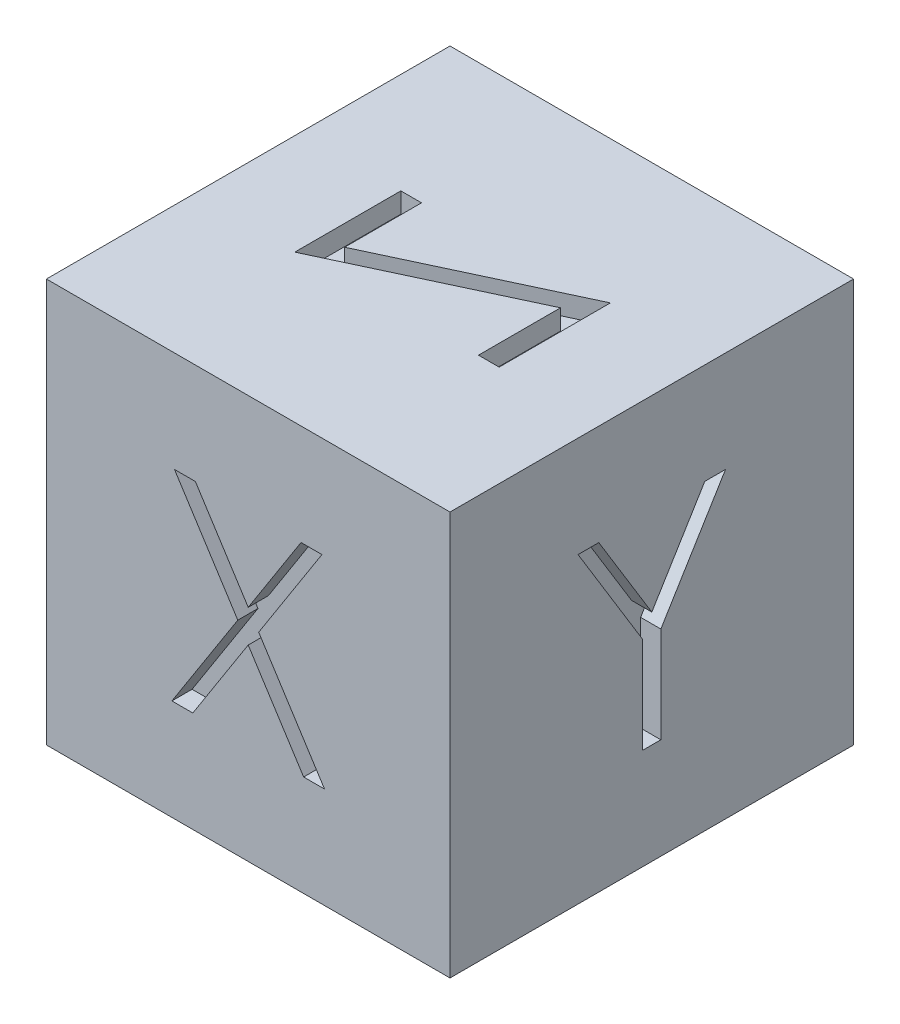
ISO-10303-21;
HEADER;
FILE_DESCRIPTION(('STEP AP214'),'2;1');
FILE_NAME('part.step','',(''),(''),'','','');
FILE_SCHEMA(('AUTOMOTIVE_DESIGN { 1 0 10303 214 1 1 1 1 }'));
ENDSEC;
DATA;
#1=APPLICATION_CONTEXT('core data for automotive mechanical design processes');
#2=APPLICATION_PROTOCOL_DEFINITION('international standard','automotive_design',2000,#1);
#3=PRODUCT_CONTEXT('',#1,'mechanical');
#4=PRODUCT('Part','Part','',(#3));
#5=PRODUCT_RELATED_PRODUCT_CATEGORY('part','',(#4));
#6=PRODUCT_DEFINITION_FORMATION('','',#4);
#7=PRODUCT_DEFINITION_CONTEXT('part definition',#1,'design');
#8=PRODUCT_DEFINITION('design','',#6,#7);
#9=PRODUCT_DEFINITION_SHAPE('','',#8);
#10=(LENGTH_UNIT() NAMED_UNIT(*) SI_UNIT(.MILLI.,.METRE.));
#11=(NAMED_UNIT(*) PLANE_ANGLE_UNIT() SI_UNIT($,.RADIAN.));
#12=(NAMED_UNIT(*) SI_UNIT($,.STERADIAN.) SOLID_ANGLE_UNIT());
#13=UNCERTAINTY_MEASURE_WITH_UNIT(LENGTH_MEASURE(1.E-05),#10,'distance_accuracy_value','');
#14=(GEOMETRIC_REPRESENTATION_CONTEXT(3) GLOBAL_UNCERTAINTY_ASSIGNED_CONTEXT((#13)) GLOBAL_UNIT_ASSIGNED_CONTEXT((#10,
#11,#12)) REPRESENTATION_CONTEXT('',''));
#15=CARTESIAN_POINT('',(0.,0.,0.));
#16=DIRECTION('',(0.,0.,1.));
#17=DIRECTION('',(1.,0.,0.));
#18=AXIS2_PLACEMENT_3D('',#15,#16,#17);
#19=CARTESIAN_POINT('',(10.,-10.,20.));
#20=DIRECTION('',(-1.,0.,0.));
#21=DIRECTION('',(0.,0.,1.));
#22=AXIS2_PLACEMENT_3D('',#19,#20,#21);
#23=PLANE('',#22);
#24=DIRECTION('',(0.,1.,0.));
#25=VECTOR('',#24,1.);
#26=CARTESIAN_POINT('',(10.,-10.,0.));
#27=LINE('',#26,#25);
#28=CARTESIAN_POINT('',(10.,-10.,0.));
#29=VERTEX_POINT('',#28);
#30=CARTESIAN_POINT('',(10.,10.,0.));
#31=VERTEX_POINT('',#30);
#32=EDGE_CURVE('E473',#29,#31,#27,.T.);
#33=ORIENTED_EDGE('',*,*,#32,.T.);
#34=DIRECTION('',(0.,0.,-1.));
#35=VECTOR('',#34,1.);
#36=CARTESIAN_POINT('',(10.,10.,20.));
#37=LINE('',#36,#35);
#38=CARTESIAN_POINT('',(10.,10.,20.));
#39=VERTEX_POINT('',#38);
#40=EDGE_CURVE('E11',#39,#31,#37,.T.);
#41=ORIENTED_EDGE('',*,*,#40,.F.);
#42=DIRECTION('',(0.,1.,0.));
#43=VECTOR('',#42,1.);
#44=CARTESIAN_POINT('',(10.,-10.,20.));
#45=LINE('',#44,#43);
#46=CARTESIAN_POINT('',(10.,-10.,20.));
#47=VERTEX_POINT('',#46);
#48=EDGE_CURVE('E474',#47,#39,#45,.T.);
#49=ORIENTED_EDGE('',*,*,#48,.F.);
#50=DIRECTION('',(0.,0.,-1.));
#51=VECTOR('',#50,1.);
#52=CARTESIAN_POINT('',(10.,-10.,20.));
#53=LINE('',#52,#51);
#54=EDGE_CURVE('E484',#47,#29,#53,.T.);
#55=ORIENTED_EDGE('',*,*,#54,.T.);
#56=EDGE_LOOP('',(#33,#41,#49,#55));
#57=FACE_BOUND('',#56,.T.);
#58=DIRECTION('',(0.,0.853354313900651,0.521331386880887));
#59=VECTOR('',#58,1.);
#60=CARTESIAN_POINT('',(10.,-0.246394230769231,10.448717948718));
#61=LINE('',#60,#59);
#62=CARTESIAN_POINT('',(10.,-0.246394230769231,10.448717948718));
#63=VERTEX_POINT('',#62);
#64=CARTESIAN_POINT('',(10.,5.,13.6538461538462));
#65=VERTEX_POINT('',#64);
#66=EDGE_CURVE('E60',#63,#65,#61,.T.);
#67=ORIENTED_EDGE('',*,*,#66,.T.);
#68=DIRECTION('',(0.,0.,-1.));
#69=VECTOR('',#68,1.);
#70=CARTESIAN_POINT('',(10.,5.,13.6538461538462));
#71=LINE('',#70,#69);
#72=CARTESIAN_POINT('',(10.,5.,12.6262019230769));
#73=VERTEX_POINT('',#72);
#74=EDGE_CURVE('E346',#65,#73,#71,.T.);
#75=ORIENTED_EDGE('',*,*,#74,.T.);
#76=DIRECTION('',(0.,-0.853075318126463,-0.521787793651244));
#77=VECTOR('',#76,1.);
#78=CARTESIAN_POINT('',(10.,5.,12.6262019230769));
#79=LINE('',#78,#77);
#80=CARTESIAN_POINT('',(10.,0.703124999999999,9.9979967948718));
#81=VERTEX_POINT('',#80);
#82=EDGE_CURVE('E349',#73,#81,#79,.T.);
#83=ORIENTED_EDGE('',*,*,#82,.T.);
#84=DIRECTION('',(0.,0.853429324019757,-0.521208584832579));
#85=VECTOR('',#84,1.);
#86=CARTESIAN_POINT('',(10.,0.703124999999999,9.9979967948718));
#87=LINE('',#86,#85);
#88=CARTESIAN_POINT('',(10.,5.,7.37379807692308));
#89=VERTEX_POINT('',#88);
#90=EDGE_CURVE('E352',#81,#89,#87,.T.);
#91=ORIENTED_EDGE('',*,*,#90,.T.);
#92=DIRECTION('',(0.,0.,-1.));
#93=VECTOR('',#92,1.);
#94=CARTESIAN_POINT('',(10.,5.,7.37379807692308));
#95=LINE('',#94,#93);
#96=CARTESIAN_POINT('',(10.,5.,6.34615384615385));
#97=VERTEX_POINT('',#96);
#98=EDGE_CURVE('E355',#89,#97,#95,.T.);
#99=ORIENTED_EDGE('',*,*,#98,.T.);
#100=DIRECTION('',(0.,-0.853354313900651,0.521331386880887));
#101=VECTOR('',#100,1.);
#102=CARTESIAN_POINT('',(10.,5.,6.34615384615385));
#103=LINE('',#102,#101);
#104=CARTESIAN_POINT('',(10.,-0.246394230769231,9.55128205128205));
#105=VERTEX_POINT('',#104);
#106=EDGE_CURVE('E358',#97,#105,#103,.T.);
#107=ORIENTED_EDGE('',*,*,#106,.T.);
#108=DIRECTION('',(0.,-1.,0.));
#109=VECTOR('',#108,1.);
#110=CARTESIAN_POINT('',(10.,-0.246394230769231,9.55128205128205));
#111=LINE('',#110,#109);
#112=CARTESIAN_POINT('',(10.,-5.,9.55128205128205));
#113=VERTEX_POINT('',#112);
#114=EDGE_CURVE('E361',#105,#113,#111,.T.);
#115=ORIENTED_EDGE('',*,*,#114,.T.);
#116=DIRECTION('',(0.,0.,1.));
#117=VECTOR('',#116,1.);
#118=CARTESIAN_POINT('',(10.,-5.,9.55128205128205));
#119=LINE('',#118,#117);
#120=CARTESIAN_POINT('',(10.,-5.,10.448717948718));
#121=VERTEX_POINT('',#120);
#122=EDGE_CURVE('E364',#113,#121,#119,.T.);
#123=ORIENTED_EDGE('',*,*,#122,.T.);
#124=DIRECTION('',(0.,1.,0.));
#125=VECTOR('',#124,1.);
#126=CARTESIAN_POINT('',(10.,-5.,10.448717948718));
#127=LINE('',#126,#125);
#128=EDGE_CURVE('E328',#121,#63,#127,.T.);
#129=ORIENTED_EDGE('',*,*,#128,.T.);
#130=EDGE_LOOP('',(#67,#75,#83,#91,#99,#107,#115,#123,#129));
#131=FACE_BOUND('',#130,.T.);
#132=ADVANCED_FACE('F38',(#57,#131),#23,.F.);
#133=CARTESIAN_POINT('',(0.,0.,20.));
#134=DIRECTION('',(0.,0.,-1.));
#135=DIRECTION('',(-1.,0.,0.));
#136=AXIS2_PLACEMENT_3D('',#133,#134,#135);
#137=PLANE('',#136);
#138=ORIENTED_EDGE('',*,*,#48,.T.);
#139=DIRECTION('',(-1.,0.,0.));
#140=VECTOR('',#139,1.);
#141=CARTESIAN_POINT('',(-10.,10.,20.));
#142=LINE('',#141,#140);
#143=CARTESIAN_POINT('',(-10.,10.,20.));
#144=VERTEX_POINT('',#143);
#145=EDGE_CURVE('E477',#39,#144,#142,.T.);
#146=ORIENTED_EDGE('',*,*,#145,.T.);
#147=DIRECTION('',(0.,-1.,0.));
#148=VECTOR('',#147,1.);
#149=CARTESIAN_POINT('',(-10.,-10.,20.));
#150=LINE('',#149,#148);
#151=CARTESIAN_POINT('',(-10.,-10.,20.));
#152=VERTEX_POINT('',#151);
#153=EDGE_CURVE('E480',#144,#152,#150,.T.);
#154=ORIENTED_EDGE('',*,*,#153,.T.);
#155=DIRECTION('',(1.,0.,0.));
#156=VECTOR('',#155,1.);
#157=CARTESIAN_POINT('',(-10.,-10.,20.));
#158=LINE('',#157,#156);
#159=EDGE_CURVE('E482',#152,#47,#158,.T.);
#160=ORIENTED_EDGE('',*,*,#159,.T.);
#161=EDGE_LOOP('',(#138,#146,#154,#160));
#162=FACE_BOUND('',#161,.T.);
#163=DIRECTION('',(-0.539190475611024,0.842183846324754,0.));
#164=VECTOR('',#163,1.);
#165=CARTESIAN_POINT('',(-0.516826923076921,0.100160256410255,20.));
#166=LINE('',#165,#164);
#167=CARTESIAN_POINT('',(-0.516826923076921,0.100160256410255,20.));
#168=VERTEX_POINT('',#167);
#169=CARTESIAN_POINT('',(-3.65384615384615,5.,20.));
#170=VERTEX_POINT('',#169);
#171=EDGE_CURVE('E386',#168,#170,#166,.T.);
#172=ORIENTED_EDGE('',*,*,#171,.T.);
#173=DIRECTION('',(1.,0.,0.));
#174=VECTOR('',#173,1.);
#175=CARTESIAN_POINT('',(-3.65384615384615,5.,20.));
#176=LINE('',#175,#174);
#177=CARTESIAN_POINT('',(-2.6181891025641,5.,20.));
#178=VERTEX_POINT('',#177);
#179=EDGE_CURVE('E416',#170,#178,#176,.T.);
#180=ORIENTED_EDGE('',*,*,#179,.T.);
#181=DIRECTION('',(0.539088809128561,-0.842248927498486,0.));
#182=VECTOR('',#181,1.);
#183=CARTESIAN_POINT('',(-2.6181891025641,5.,20.));
#184=LINE('',#183,#182);
#185=CARTESIAN_POINT('',(0.,0.909455128205127,20.));
#186=VERTEX_POINT('',#185);
#187=EDGE_CURVE('E419',#178,#186,#184,.T.);
#188=ORIENTED_EDGE('',*,*,#187,.T.);
#189=DIRECTION('',(0.539088809128561,0.842248927498486,0.));
#190=VECTOR('',#189,1.);
#191=CARTESIAN_POINT('',(0.,0.909455128205127,20.));
#192=LINE('',#191,#190);
#193=CARTESIAN_POINT('',(2.6181891025641,5.,20.));
#194=VERTEX_POINT('',#193);
#195=EDGE_CURVE('E422',#186,#194,#192,.T.);
#196=ORIENTED_EDGE('',*,*,#195,.T.);
#197=DIRECTION('',(1.,0.,0.));
#198=VECTOR('',#197,1.);
#199=CARTESIAN_POINT('',(2.6181891025641,5.,20.));
#200=LINE('',#199,#198);
#201=CARTESIAN_POINT('',(3.65384615384616,5.,20.));
#202=VERTEX_POINT('',#201);
#203=EDGE_CURVE('E425',#194,#202,#200,.T.);
#204=ORIENTED_EDGE('',*,*,#203,.T.);
#205=DIRECTION('',(-0.538946197134426,-0.842340190537256,0.));
#206=VECTOR('',#205,1.);
#207=CARTESIAN_POINT('',(3.65384615384616,5.,20.));
#208=LINE('',#207,#206);
#209=CARTESIAN_POINT('',(0.51883012820513,0.100160256410255,20.));
#210=VERTEX_POINT('',#209);
#211=EDGE_CURVE('E428',#202,#210,#208,.T.);
#212=ORIENTED_EDGE('',*,*,#211,.T.);
#213=DIRECTION('',(0.538950419912938,-0.842337488703707,0.));
#214=VECTOR('',#213,1.);
#215=CARTESIAN_POINT('',(0.51883012820513,0.100160256410255,20.));
#216=LINE('',#215,#214);
#217=CARTESIAN_POINT('',(3.78205128205128,-5.,20.));
#218=VERTEX_POINT('',#217);
#219=EDGE_CURVE('E431',#210,#218,#216,.T.);
#220=ORIENTED_EDGE('',*,*,#219,.T.);
#221=DIRECTION('',(-1.,0.,0.));
#222=VECTOR('',#221,1.);
#223=CARTESIAN_POINT('',(3.78205128205128,-5.,20.));
#224=LINE('',#223,#222);
#225=CARTESIAN_POINT('',(2.74639423076923,-5.,20.));
#226=VERTEX_POINT('',#225);
#227=EDGE_CURVE('E434',#218,#226,#224,.T.);
#228=ORIENTED_EDGE('',*,*,#227,.T.);
#229=DIRECTION('',(-0.539087169942497,0.842249976671647,0.));
#230=VECTOR('',#229,1.);
#231=CARTESIAN_POINT('',(2.74639423076923,-5.,20.));
#232=LINE('',#231,#230);
#233=CARTESIAN_POINT('',(0.,-0.709134615384617,20.));
#234=VERTEX_POINT('',#233);
#235=EDGE_CURVE('E437',#226,#234,#232,.T.);
#236=ORIENTED_EDGE('',*,*,#235,.T.);
#237=DIRECTION('',(-0.539087169942497,-0.842249976671647,0.));
#238=VECTOR('',#237,1.);
#239=CARTESIAN_POINT('',(0.,-0.709134615384617,20.));
#240=LINE('',#239,#238);
#241=CARTESIAN_POINT('',(-2.74639423076923,-5.,20.));
#242=VERTEX_POINT('',#241);
#243=EDGE_CURVE('E440',#234,#242,#240,.T.);
#244=ORIENTED_EDGE('',*,*,#243,.T.);
#245=DIRECTION('',(-1.,0.,0.));
#246=VECTOR('',#245,1.);
#247=CARTESIAN_POINT('',(-2.74639423076923,-5.,20.));
#248=LINE('',#247,#246);
#249=CARTESIAN_POINT('',(-3.78205128205128,-5.,20.));
#250=VERTEX_POINT('',#249);
#251=EDGE_CURVE('E443',#242,#250,#248,.T.);
#252=ORIENTED_EDGE('',*,*,#251,.T.);
#253=DIRECTION('',(0.539185104098949,0.842187285298113,0.));
#254=VECTOR('',#253,1.);
#255=CARTESIAN_POINT('',(-3.78205128205128,-5.,20.));
#256=LINE('',#255,#254);
#257=EDGE_CURVE('E391',#250,#168,#256,.T.);
#258=ORIENTED_EDGE('',*,*,#257,.T.);
#259=EDGE_LOOP('',(#172,#180,#188,#196,#204,#212,#220,#228,#236,#244,#252,#258));
#260=FACE_BOUND('',#259,.T.);
#261=ADVANCED_FACE('F517',(#162,#260),#137,.F.);
#262=CARTESIAN_POINT('',(-10.,10.,20.));
#263=DIRECTION('',(0.,-1.,0.));
#264=DIRECTION('',(0.,0.,-1.));
#265=AXIS2_PLACEMENT_3D('',#262,#263,#264);
#266=PLANE('',#265);
#267=DIRECTION('',(-1.,0.,0.));
#268=VECTOR('',#267,1.);
#269=CARTESIAN_POINT('',(-3.97435897435897,10.0000000000001,7.43589743589744));
#270=LINE('',#269,#268);
#271=CARTESIAN_POINT('',(-3.97435897435897,10.,7.43589743589744));
#272=VERTEX_POINT('',#271);
#273=CARTESIAN_POINT('',(-5.,10.0000000000001,7.43589743589744));
#274=VERTEX_POINT('',#273);
#275=EDGE_CURVE('E295',#272,#274,#270,.T.);
#276=ORIENTED_EDGE('',*,*,#275,.F.);
#277=DIRECTION('',(0.,0.,-1.));
#278=VECTOR('',#277,1.);
#279=CARTESIAN_POINT('',(-3.97435897435897,10.0000000000001,11.2459935897436));
#280=LINE('',#279,#278);
#281=CARTESIAN_POINT('',(-3.97435897435897,10.0000000000001,11.2459935897436));
#282=VERTEX_POINT('',#281);
#283=EDGE_CURVE('E52',#282,#272,#280,.T.);
#284=ORIENTED_EDGE('',*,*,#283,.F.);
#285=DIRECTION('',(-0.905924666699453,0.,0.42343889555104));
#286=VECTOR('',#285,1.);
#287=CARTESIAN_POINT('',(5.,10.,7.05128205128205));
#288=LINE('',#287,#286);
#289=CARTESIAN_POINT('',(5.,10.,7.05128205128205));
#290=VERTEX_POINT('',#289);
#291=EDGE_CURVE('E275',#290,#282,#288,.T.);
#292=ORIENTED_EDGE('',*,*,#291,.F.);
#293=DIRECTION('',(0.,0.,-1.));
#294=VECTOR('',#293,1.);
#295=CARTESIAN_POINT('',(5.,10.,12.5641025641026));
#296=LINE('',#295,#294);
#297=CARTESIAN_POINT('',(5.,10.,12.5641025641026));
#298=VERTEX_POINT('',#297);
#299=EDGE_CURVE('E278',#298,#290,#296,.T.);
#300=ORIENTED_EDGE('',*,*,#299,.F.);
#301=DIRECTION('',(1.,0.,0.));
#302=VECTOR('',#301,1.);
#303=CARTESIAN_POINT('',(3.97435897435898,10.,12.5641025641026));
#304=LINE('',#303,#302);
#305=CARTESIAN_POINT('',(3.97435897435898,10.,12.5641025641026));
#306=VERTEX_POINT('',#305);
#307=EDGE_CURVE('E306',#306,#298,#304,.T.);
#308=ORIENTED_EDGE('',*,*,#307,.F.);
#309=DIRECTION('',(0.,0.,1.));
#310=VECTOR('',#309,1.);
#311=CARTESIAN_POINT('',(3.97435897435897,10.,8.49759615384616));
#312=LINE('',#311,#310);
#313=CARTESIAN_POINT('',(3.97435897435897,10.,8.49759615384616));
#314=VERTEX_POINT('',#313);
#315=EDGE_CURVE('E303',#314,#306,#312,.T.);
#316=ORIENTED_EDGE('',*,*,#315,.F.);
#317=DIRECTION('',(0.905924666699453,0.,-0.42343889555104));
#318=VECTOR('',#317,1.);
#319=CARTESIAN_POINT('',(-5.,10.0000000000001,12.6923076923077));
#320=LINE('',#319,#318);
#321=CARTESIAN_POINT('',(-5.,10.0000000000001,12.6923076923077));
#322=VERTEX_POINT('',#321);
#323=EDGE_CURVE('E300',#322,#314,#320,.T.);
#324=ORIENTED_EDGE('',*,*,#323,.F.);
#325=DIRECTION('',(0.,0.,1.));
#326=VECTOR('',#325,1.);
#327=CARTESIAN_POINT('',(-5.,10.0000000000001,7.43589743589744));
#328=LINE('',#327,#326);
#329=EDGE_CURVE('E297',#274,#322,#328,.T.);
#330=ORIENTED_EDGE('',*,*,#329,.F.);
#331=EDGE_LOOP('',(#276,#284,#292,#300,#308,#316,#324,#330));
#332=FACE_BOUND('',#331,.T.);
#333=DIRECTION('',(-1.,0.,0.));
#334=VECTOR('',#333,1.);
#335=CARTESIAN_POINT('',(-10.,10.,0.));
#336=LINE('',#335,#334);
#337=CARTESIAN_POINT('',(-10.,10.,0.));
#338=VERTEX_POINT('',#337);
#339=EDGE_CURVE('E487',#31,#338,#336,.T.);
#340=ORIENTED_EDGE('',*,*,#339,.T.);
#341=DIRECTION('',(0.,0.,-1.));
#342=VECTOR('',#341,1.);
#343=CARTESIAN_POINT('',(-10.,10.,20.));
#344=LINE('',#343,#342);
#345=EDGE_CURVE('E45',#144,#338,#344,.T.);
#346=ORIENTED_EDGE('',*,*,#345,.F.);
#347=ORIENTED_EDGE('',*,*,#145,.F.);
#348=ORIENTED_EDGE('',*,*,#40,.T.);
#349=EDGE_LOOP('',(#340,#346,#347,#348));
#350=FACE_BOUND('',#349,.T.);
#351=ADVANCED_FACE('F519',(#332,#350),#266,.F.);
#352=CARTESIAN_POINT('',(-10.,-10.,20.));
#353=DIRECTION('',(1.,0.,0.));
#354=DIRECTION('',(0.,0.,-1.));
#355=AXIS2_PLACEMENT_3D('',#352,#353,#354);
#356=PLANE('',#355);
#357=DIRECTION('',(0.,-1.,0.));
#358=VECTOR('',#357,1.);
#359=CARTESIAN_POINT('',(-10.,-10.,0.));
#360=LINE('',#359,#358);
#361=CARTESIAN_POINT('',(-10.,-10.,0.));
#362=VERTEX_POINT('',#361);
#363=EDGE_CURVE('E489',#338,#362,#360,.T.);
#364=ORIENTED_EDGE('',*,*,#363,.T.);
#365=DIRECTION('',(0.,0.,-1.));
#366=VECTOR('',#365,1.);
#367=CARTESIAN_POINT('',(-10.,-10.,20.));
#368=LINE('',#367,#366);
#369=EDGE_CURVE('E494',#152,#362,#368,.T.);
#370=ORIENTED_EDGE('',*,*,#369,.F.);
#371=ORIENTED_EDGE('',*,*,#153,.F.);
#372=ORIENTED_EDGE('',*,*,#345,.T.);
#373=EDGE_LOOP('',(#364,#370,#371,#372));
#374=FACE_BOUND('',#373,.T.);
#375=ADVANCED_FACE('F501',(#374),#356,.F.);
#376=CARTESIAN_POINT('',(-10.,-10.,20.));
#377=DIRECTION('',(0.,1.,0.));
#378=DIRECTION('',(0.,0.,1.));
#379=AXIS2_PLACEMENT_3D('',#376,#377,#378);
#380=PLANE('',#379);
#381=DIRECTION('',(1.,0.,0.));
#382=VECTOR('',#381,1.);
#383=CARTESIAN_POINT('',(-10.,-10.,0.));
#384=LINE('',#383,#382);
#385=EDGE_CURVE('E478',#362,#29,#384,.T.);
#386=ORIENTED_EDGE('',*,*,#385,.T.);
#387=ORIENTED_EDGE('',*,*,#54,.F.);
#388=ORIENTED_EDGE('',*,*,#159,.F.);
#389=ORIENTED_EDGE('',*,*,#369,.T.);
#390=EDGE_LOOP('',(#386,#387,#388,#389));
#391=FACE_BOUND('',#390,.T.);
#392=ADVANCED_FACE('F510',(#391),#380,.F.);
#393=CARTESIAN_POINT('',(0.,0.,0.));
#394=DIRECTION('',(0.,0.,-1.));
#395=DIRECTION('',(-1.,0.,0.));
#396=AXIS2_PLACEMENT_3D('',#393,#394,#395);
#397=PLANE('',#396);
#398=ORIENTED_EDGE('',*,*,#32,.F.);
#399=ORIENTED_EDGE('',*,*,#385,.F.);
#400=ORIENTED_EDGE('',*,*,#363,.F.);
#401=ORIENTED_EDGE('',*,*,#339,.F.);
#402=EDGE_LOOP('',(#398,#399,#400,#401));
#403=FACE_BOUND('',#402,.T.);
#404=ADVANCED_FACE('F507',(#403),#397,.T.);
#405=CARTESIAN_POINT('',(-0.516826923076921,0.100160256410255,19.));
#406=DIRECTION('',(0.842183846324754,0.539190475611024,0.));
#407=DIRECTION('',(-0.539190475611024,0.842183846324754,0.));
#408=AXIS2_PLACEMENT_3D('',#405,#406,#407);
#409=PLANE('',#408);
#410=ORIENTED_EDGE('',*,*,#171,.F.);
#411=DIRECTION('',(0.,0.,1.));
#412=VECTOR('',#411,1.);
#413=CARTESIAN_POINT('',(-0.516826923076921,0.100160256410255,19.));
#414=LINE('',#413,#412);
#415=CARTESIAN_POINT('',(-0.516826923076921,0.100160256410255,19.));
#416=VERTEX_POINT('',#415);
#417=EDGE_CURVE('E413',#416,#168,#414,.T.);
#418=ORIENTED_EDGE('',*,*,#417,.F.);
#419=DIRECTION('',(-0.539190475611024,0.842183846324754,0.));
#420=VECTOR('',#419,1.);
#421=CARTESIAN_POINT('',(-0.516826923076921,0.100160256410255,19.));
#422=LINE('',#421,#420);
#423=CARTESIAN_POINT('',(-3.65384615384615,5.,19.));
#424=VERTEX_POINT('',#423);
#425=EDGE_CURVE('E387',#416,#424,#422,.T.);
#426=ORIENTED_EDGE('',*,*,#425,.T.);
#427=DIRECTION('',(0.,0.,1.));
#428=VECTOR('',#427,1.);
#429=CARTESIAN_POINT('',(-3.65384615384615,5.,19.));
#430=LINE('',#429,#428);
#431=EDGE_CURVE('E470',#424,#170,#430,.T.);
#432=ORIENTED_EDGE('',*,*,#431,.T.);
#433=EDGE_LOOP('',(#410,#418,#426,#432));
#434=FACE_BOUND('',#433,.T.);
#435=ADVANCED_FACE('F769',(#434),#409,.T.);
#436=CARTESIAN_POINT('',(-3.65384615384615,5.,19.));
#437=DIRECTION('',(0.,-1.,0.));
#438=DIRECTION('',(0.,0.,-1.));
#439=AXIS2_PLACEMENT_3D('',#436,#437,#438);
#440=PLANE('',#439);
#441=ORIENTED_EDGE('',*,*,#179,.F.);
#442=ORIENTED_EDGE('',*,*,#431,.F.);
#443=DIRECTION('',(1.,0.,0.));
#444=VECTOR('',#443,1.);
#445=CARTESIAN_POINT('',(-3.65384615384615,5.,19.));
#446=LINE('',#445,#444);
#447=CARTESIAN_POINT('',(-2.6181891025641,5.,19.));
#448=VERTEX_POINT('',#447);
#449=EDGE_CURVE('E390',#424,#448,#446,.T.);
#450=ORIENTED_EDGE('',*,*,#449,.T.);
#451=DIRECTION('',(0.,0.,1.));
#452=VECTOR('',#451,1.);
#453=CARTESIAN_POINT('',(-2.6181891025641,5.,19.));
#454=LINE('',#453,#452);
#455=EDGE_CURVE('E468',#448,#178,#454,.T.);
#456=ORIENTED_EDGE('',*,*,#455,.T.);
#457=EDGE_LOOP('',(#441,#442,#450,#456));
#458=FACE_BOUND('',#457,.T.);
#459=ADVANCED_FACE('F765',(#458),#440,.T.);
#460=CARTESIAN_POINT('',(-2.6181891025641,5.,19.));
#461=DIRECTION('',(-0.842248927498486,-0.539088809128561,0.));
#462=DIRECTION('',(0.539088809128561,-0.842248927498486,0.));
#463=AXIS2_PLACEMENT_3D('',#460,#461,#462);
#464=PLANE('',#463);
#465=ORIENTED_EDGE('',*,*,#187,.F.);
#466=ORIENTED_EDGE('',*,*,#455,.F.);
#467=DIRECTION('',(0.539088809128561,-0.842248927498486,0.));
#468=VECTOR('',#467,1.);
#469=CARTESIAN_POINT('',(-2.6181891025641,5.,19.));
#470=LINE('',#469,#468);
#471=CARTESIAN_POINT('',(0.,0.909455128205127,19.));
#472=VERTEX_POINT('',#471);
#473=EDGE_CURVE('E393',#448,#472,#470,.T.);
#474=ORIENTED_EDGE('',*,*,#473,.T.);
#475=DIRECTION('',(0.,0.,1.));
#476=VECTOR('',#475,1.);
#477=CARTESIAN_POINT('',(0.,0.909455128205127,19.));
#478=LINE('',#477,#476);
#479=EDGE_CURVE('E466',#472,#186,#478,.T.);
#480=ORIENTED_EDGE('',*,*,#479,.T.);
#481=EDGE_LOOP('',(#465,#466,#474,#480));
#482=FACE_BOUND('',#481,.T.);
#483=ADVANCED_FACE('F761',(#482),#464,.T.);
#484=CARTESIAN_POINT('',(0.,0.909455128205127,19.));
#485=DIRECTION('',(0.842248927498486,-0.539088809128561,0.));
#486=DIRECTION('',(0.539088809128561,0.842248927498486,0.));
#487=AXIS2_PLACEMENT_3D('',#484,#485,#486);
#488=PLANE('',#487);
#489=ORIENTED_EDGE('',*,*,#195,.F.);
#490=ORIENTED_EDGE('',*,*,#479,.F.);
#491=DIRECTION('',(0.539088809128561,0.842248927498486,0.));
#492=VECTOR('',#491,1.);
#493=CARTESIAN_POINT('',(0.,0.909455128205127,19.));
#494=LINE('',#493,#492);
#495=CARTESIAN_POINT('',(2.6181891025641,5.,19.));
#496=VERTEX_POINT('',#495);
#497=EDGE_CURVE('E395',#472,#496,#494,.T.);
#498=ORIENTED_EDGE('',*,*,#497,.T.);
#499=DIRECTION('',(0.,0.,1.));
#500=VECTOR('',#499,1.);
#501=CARTESIAN_POINT('',(2.6181891025641,5.,19.));
#502=LINE('',#501,#500);
#503=EDGE_CURVE('E464',#496,#194,#502,.T.);
#504=ORIENTED_EDGE('',*,*,#503,.T.);
#505=EDGE_LOOP('',(#489,#490,#498,#504));
#506=FACE_BOUND('',#505,.T.);
#507=ADVANCED_FACE('F757',(#506),#488,.T.);
#508=CARTESIAN_POINT('',(2.6181891025641,5.,19.));
#509=DIRECTION('',(0.,-1.,0.));
#510=DIRECTION('',(0.,0.,-1.));
#511=AXIS2_PLACEMENT_3D('',#508,#509,#510);
#512=PLANE('',#511);
#513=ORIENTED_EDGE('',*,*,#203,.F.);
#514=ORIENTED_EDGE('',*,*,#503,.F.);
#515=DIRECTION('',(1.,0.,0.));
#516=VECTOR('',#515,1.);
#517=CARTESIAN_POINT('',(2.6181891025641,5.,19.));
#518=LINE('',#517,#516);
#519=CARTESIAN_POINT('',(3.65384615384616,5.,19.));
#520=VERTEX_POINT('',#519);
#521=EDGE_CURVE('E397',#496,#520,#518,.T.);
#522=ORIENTED_EDGE('',*,*,#521,.T.);
#523=DIRECTION('',(0.,0.,1.));
#524=VECTOR('',#523,1.);
#525=CARTESIAN_POINT('',(3.65384615384616,5.,19.));
#526=LINE('',#525,#524);
#527=EDGE_CURVE('E462',#520,#202,#526,.T.);
#528=ORIENTED_EDGE('',*,*,#527,.T.);
#529=EDGE_LOOP('',(#513,#514,#522,#528));
#530=FACE_BOUND('',#529,.T.);
#531=ADVANCED_FACE('F753',(#530),#512,.T.);
#532=CARTESIAN_POINT('',(3.65384615384616,5.,19.));
#533=DIRECTION('',(-0.842340190537256,0.538946197134426,0.));
#534=DIRECTION('',(-0.538946197134426,-0.842340190537256,0.));
#535=AXIS2_PLACEMENT_3D('',#532,#533,#534);
#536=PLANE('',#535);
#537=ORIENTED_EDGE('',*,*,#211,.F.);
#538=ORIENTED_EDGE('',*,*,#527,.F.);
#539=DIRECTION('',(-0.538946197134426,-0.842340190537256,0.));
#540=VECTOR('',#539,1.);
#541=CARTESIAN_POINT('',(3.65384615384616,5.,19.));
#542=LINE('',#541,#540);
#543=CARTESIAN_POINT('',(0.51883012820513,0.100160256410255,19.));
#544=VERTEX_POINT('',#543);
#545=EDGE_CURVE('E399',#520,#544,#542,.T.);
#546=ORIENTED_EDGE('',*,*,#545,.T.);
#547=DIRECTION('',(0.,0.,1.));
#548=VECTOR('',#547,1.);
#549=CARTESIAN_POINT('',(0.51883012820513,0.100160256410255,19.));
#550=LINE('',#549,#548);
#551=EDGE_CURVE('E460',#544,#210,#550,.T.);
#552=ORIENTED_EDGE('',*,*,#551,.T.);
#553=EDGE_LOOP('',(#537,#538,#546,#552));
#554=FACE_BOUND('',#553,.T.);
#555=ADVANCED_FACE('F749',(#554),#536,.T.);
#556=CARTESIAN_POINT('',(0.51883012820513,0.100160256410255,19.));
#557=DIRECTION('',(-0.842337488703708,-0.538950419912938,0.));
#558=DIRECTION('',(0.538950419912937,-0.842337488703707,0.));
#559=AXIS2_PLACEMENT_3D('',#556,#557,#558);
#560=PLANE('',#559);
#561=ORIENTED_EDGE('',*,*,#219,.F.);
#562=ORIENTED_EDGE('',*,*,#551,.F.);
#563=DIRECTION('',(0.538950419912938,-0.842337488703707,0.));
#564=VECTOR('',#563,1.);
#565=CARTESIAN_POINT('',(0.51883012820513,0.100160256410255,19.));
#566=LINE('',#565,#564);
#567=CARTESIAN_POINT('',(3.78205128205128,-5.,19.));
#568=VERTEX_POINT('',#567);
#569=EDGE_CURVE('E401',#544,#568,#566,.T.);
#570=ORIENTED_EDGE('',*,*,#569,.T.);
#571=DIRECTION('',(0.,0.,1.));
#572=VECTOR('',#571,1.);
#573=CARTESIAN_POINT('',(3.78205128205128,-5.,19.));
#574=LINE('',#573,#572);
#575=EDGE_CURVE('E458',#568,#218,#574,.T.);
#576=ORIENTED_EDGE('',*,*,#575,.T.);
#577=EDGE_LOOP('',(#561,#562,#570,#576));
#578=FACE_BOUND('',#577,.T.);
#579=ADVANCED_FACE('F745',(#578),#560,.T.);
#580=CARTESIAN_POINT('',(3.78205128205128,-5.,19.));
#581=DIRECTION('',(0.,1.,0.));
#582=DIRECTION('',(0.,0.,1.));
#583=AXIS2_PLACEMENT_3D('',#580,#581,#582);
#584=PLANE('',#583);
#585=ORIENTED_EDGE('',*,*,#227,.F.);
#586=ORIENTED_EDGE('',*,*,#575,.F.);
#587=DIRECTION('',(-1.,0.,0.));
#588=VECTOR('',#587,1.);
#589=CARTESIAN_POINT('',(3.78205128205128,-5.,19.));
#590=LINE('',#589,#588);
#591=CARTESIAN_POINT('',(2.74639423076923,-5.,19.));
#592=VERTEX_POINT('',#591);
#593=EDGE_CURVE('E403',#568,#592,#590,.T.);
#594=ORIENTED_EDGE('',*,*,#593,.T.);
#595=DIRECTION('',(0.,0.,1.));
#596=VECTOR('',#595,1.);
#597=CARTESIAN_POINT('',(2.74639423076923,-5.,19.));
#598=LINE('',#597,#596);
#599=EDGE_CURVE('E456',#592,#226,#598,.T.);
#600=ORIENTED_EDGE('',*,*,#599,.T.);
#601=EDGE_LOOP('',(#585,#586,#594,#600));
#602=FACE_BOUND('',#601,.T.);
#603=ADVANCED_FACE('F741',(#602),#584,.T.);
#604=CARTESIAN_POINT('',(2.74639423076923,-5.,19.));
#605=DIRECTION('',(0.842249976671647,0.539087169942497,0.));
#606=DIRECTION('',(-0.539087169942497,0.842249976671647,0.));
#607=AXIS2_PLACEMENT_3D('',#604,#605,#606);
#608=PLANE('',#607);
#609=ORIENTED_EDGE('',*,*,#235,.F.);
#610=ORIENTED_EDGE('',*,*,#599,.F.);
#611=DIRECTION('',(-0.539087169942497,0.842249976671647,0.));
#612=VECTOR('',#611,1.);
#613=CARTESIAN_POINT('',(2.74639423076923,-5.,19.));
#614=LINE('',#613,#612);
#615=CARTESIAN_POINT('',(0.,-0.709134615384617,19.));
#616=VERTEX_POINT('',#615);
#617=EDGE_CURVE('E405',#592,#616,#614,.T.);
#618=ORIENTED_EDGE('',*,*,#617,.T.);
#619=DIRECTION('',(0.,0.,1.));
#620=VECTOR('',#619,1.);
#621=CARTESIAN_POINT('',(0.,-0.709134615384617,19.));
#622=LINE('',#621,#620);
#623=EDGE_CURVE('E454',#616,#234,#622,.T.);
#624=ORIENTED_EDGE('',*,*,#623,.T.);
#625=EDGE_LOOP('',(#609,#610,#618,#624));
#626=FACE_BOUND('',#625,.T.);
#627=ADVANCED_FACE('F737',(#626),#608,.T.);
#628=CARTESIAN_POINT('',(0.,-0.709134615384617,19.));
#629=DIRECTION('',(-0.842249976671647,0.539087169942497,0.));
#630=DIRECTION('',(-0.539087169942497,-0.842249976671647,0.));
#631=AXIS2_PLACEMENT_3D('',#628,#629,#630);
#632=PLANE('',#631);
#633=ORIENTED_EDGE('',*,*,#243,.F.);
#634=ORIENTED_EDGE('',*,*,#623,.F.);
#635=DIRECTION('',(-0.539087169942497,-0.842249976671647,0.));
#636=VECTOR('',#635,1.);
#637=CARTESIAN_POINT('',(0.,-0.709134615384617,19.));
#638=LINE('',#637,#636);
#639=CARTESIAN_POINT('',(-2.74639423076923,-5.,19.));
#640=VERTEX_POINT('',#639);
#641=EDGE_CURVE('E407',#616,#640,#638,.T.);
#642=ORIENTED_EDGE('',*,*,#641,.T.);
#643=DIRECTION('',(0.,0.,1.));
#644=VECTOR('',#643,1.);
#645=CARTESIAN_POINT('',(-2.74639423076923,-5.,19.));
#646=LINE('',#645,#644);
#647=EDGE_CURVE('E452',#640,#242,#646,.T.);
#648=ORIENTED_EDGE('',*,*,#647,.T.);
#649=EDGE_LOOP('',(#633,#634,#642,#648));
#650=FACE_BOUND('',#649,.T.);
#651=ADVANCED_FACE('F733',(#650),#632,.T.);
#652=CARTESIAN_POINT('',(-2.74639423076923,-5.,19.));
#653=DIRECTION('',(0.,1.,0.));
#654=DIRECTION('',(0.,0.,1.));
#655=AXIS2_PLACEMENT_3D('',#652,#653,#654);
#656=PLANE('',#655);
#657=ORIENTED_EDGE('',*,*,#251,.F.);
#658=ORIENTED_EDGE('',*,*,#647,.F.);
#659=DIRECTION('',(-1.,0.,0.));
#660=VECTOR('',#659,1.);
#661=CARTESIAN_POINT('',(-2.74639423076923,-5.,19.));
#662=LINE('',#661,#660);
#663=CARTESIAN_POINT('',(-3.78205128205128,-5.,19.));
#664=VERTEX_POINT('',#663);
#665=EDGE_CURVE('E409',#640,#664,#662,.T.);
#666=ORIENTED_EDGE('',*,*,#665,.T.);
#667=DIRECTION('',(0.,0.,1.));
#668=VECTOR('',#667,1.);
#669=CARTESIAN_POINT('',(-3.78205128205128,-5.,19.));
#670=LINE('',#669,#668);
#671=EDGE_CURVE('E450',#664,#250,#670,.T.);
#672=ORIENTED_EDGE('',*,*,#671,.T.);
#673=EDGE_LOOP('',(#657,#658,#666,#672));
#674=FACE_BOUND('',#673,.T.);
#675=ADVANCED_FACE('F729',(#674),#656,.T.);
#676=CARTESIAN_POINT('',(-3.78205128205128,-5.,19.));
#677=DIRECTION('',(0.842187285298113,-0.539185104098949,0.));
#678=DIRECTION('',(0.539185104098949,0.842187285298113,0.));
#679=AXIS2_PLACEMENT_3D('',#676,#677,#678);
#680=PLANE('',#679);
#681=ORIENTED_EDGE('',*,*,#257,.F.);
#682=ORIENTED_EDGE('',*,*,#671,.F.);
#683=DIRECTION('',(0.539185104098949,0.842187285298113,0.));
#684=VECTOR('',#683,1.);
#685=CARTESIAN_POINT('',(-3.78205128205128,-5.,19.));
#686=LINE('',#685,#684);
#687=EDGE_CURVE('E411',#664,#416,#686,.T.);
#688=ORIENTED_EDGE('',*,*,#687,.T.);
#689=ORIENTED_EDGE('',*,*,#417,.T.);
#690=EDGE_LOOP('',(#681,#682,#688,#689));
#691=FACE_BOUND('',#690,.T.);
#692=ADVANCED_FACE('F725',(#691),#680,.T.);
#693=CARTESIAN_POINT('',(0.,0.,19.));
#694=DIRECTION('',(0.,0.,-1.));
#695=DIRECTION('',(-1.,0.,0.));
#696=AXIS2_PLACEMENT_3D('',#693,#694,#695);
#697=PLANE('',#696);
#698=ORIENTED_EDGE('',*,*,#425,.F.);
#699=ORIENTED_EDGE('',*,*,#687,.F.);
#700=ORIENTED_EDGE('',*,*,#665,.F.);
#701=ORIENTED_EDGE('',*,*,#641,.F.);
#702=ORIENTED_EDGE('',*,*,#617,.F.);
#703=ORIENTED_EDGE('',*,*,#593,.F.);
#704=ORIENTED_EDGE('',*,*,#569,.F.);
#705=ORIENTED_EDGE('',*,*,#545,.F.);
#706=ORIENTED_EDGE('',*,*,#521,.F.);
#707=ORIENTED_EDGE('',*,*,#497,.F.);
#708=ORIENTED_EDGE('',*,*,#473,.F.);
#709=ORIENTED_EDGE('',*,*,#449,.F.);
#710=EDGE_LOOP('',(#698,#699,#700,#701,#702,#703,#704,#705,#706,#707,#708,#709));
#711=FACE_BOUND('',#710,.T.);
#712=ADVANCED_FACE('F540',(#711),#697,.F.);
#713=CARTESIAN_POINT('',(9.,-0.246394230769231,10.448717948718));
#714=DIRECTION('',(0.,0.521331386880887,-0.853354313900651));
#715=DIRECTION('',(0.,0.853354313900651,0.521331386880887));
#716=AXIS2_PLACEMENT_3D('',#713,#714,#715);
#717=PLANE('',#716);
#718=ORIENTED_EDGE('',*,*,#66,.F.);
#719=DIRECTION('',(1.,0.,0.));
#720=VECTOR('',#719,1.);
#721=CARTESIAN_POINT('',(9.,-0.246394230769231,10.448717948718));
#722=LINE('',#721,#720);
#723=CARTESIAN_POINT('',(9.,-0.246394230769231,10.448717948718));
#724=VERTEX_POINT('',#723);
#725=EDGE_CURVE('E344',#724,#63,#722,.T.);
#726=ORIENTED_EDGE('',*,*,#725,.F.);
#727=DIRECTION('',(0.,0.853354313900651,0.521331386880887));
#728=VECTOR('',#727,1.);
#729=CARTESIAN_POINT('',(9.,-0.246394230769231,10.448717948718));
#730=LINE('',#729,#728);
#731=CARTESIAN_POINT('',(9.,5.,13.6538461538462));
#732=VERTEX_POINT('',#731);
#733=EDGE_CURVE('E324',#724,#732,#730,.T.);
#734=ORIENTED_EDGE('',*,*,#733,.T.);
#735=DIRECTION('',(1.,0.,0.));
#736=VECTOR('',#735,1.);
#737=CARTESIAN_POINT('',(9.,5.,13.6538461538462));
#738=LINE('',#737,#736);
#739=EDGE_CURVE('E384',#732,#65,#738,.T.);
#740=ORIENTED_EDGE('',*,*,#739,.T.);
#741=EDGE_LOOP('',(#718,#726,#734,#740));
#742=FACE_BOUND('',#741,.T.);
#743=ADVANCED_FACE('F544',(#742),#717,.T.);
#744=CARTESIAN_POINT('',(9.,5.,13.6538461538462));
#745=DIRECTION('',(0.,-1.,0.));
#746=DIRECTION('',(0.,0.,-1.));
#747=AXIS2_PLACEMENT_3D('',#744,#745,#746);
#748=PLANE('',#747);
#749=ORIENTED_EDGE('',*,*,#74,.F.);
#750=ORIENTED_EDGE('',*,*,#739,.F.);
#751=DIRECTION('',(0.,0.,-1.));
#752=VECTOR('',#751,1.);
#753=CARTESIAN_POINT('',(9.,5.,13.6538461538462));
#754=LINE('',#753,#752);
#755=CARTESIAN_POINT('',(9.,5.,12.6262019230769));
#756=VERTEX_POINT('',#755);
#757=EDGE_CURVE('E327',#732,#756,#754,.T.);
#758=ORIENTED_EDGE('',*,*,#757,.T.);
#759=DIRECTION('',(1.,0.,0.));
#760=VECTOR('',#759,1.);
#761=CARTESIAN_POINT('',(9.,5.,12.6262019230769));
#762=LINE('',#761,#760);
#763=EDGE_CURVE('E382',#756,#73,#762,.T.);
#764=ORIENTED_EDGE('',*,*,#763,.T.);
#765=EDGE_LOOP('',(#749,#750,#758,#764));
#766=FACE_BOUND('',#765,.T.);
#767=ADVANCED_FACE('F548',(#766),#748,.T.);
#768=CARTESIAN_POINT('',(9.,5.,12.6262019230769));
#769=DIRECTION('',(0.,-0.521787793651245,0.853075318126463));
#770=DIRECTION('',(0.,-0.853075318126463,-0.521787793651245));
#771=AXIS2_PLACEMENT_3D('',#768,#769,#770);
#772=PLANE('',#771);
#773=ORIENTED_EDGE('',*,*,#82,.F.);
#774=ORIENTED_EDGE('',*,*,#763,.F.);
#775=DIRECTION('',(0.,-0.853075318126463,-0.521787793651244));
#776=VECTOR('',#775,1.);
#777=CARTESIAN_POINT('',(9.,5.,12.6262019230769));
#778=LINE('',#777,#776);
#779=CARTESIAN_POINT('',(9.,0.703124999999999,9.9979967948718));
#780=VERTEX_POINT('',#779);
#781=EDGE_CURVE('E330',#756,#780,#778,.T.);
#782=ORIENTED_EDGE('',*,*,#781,.T.);
#783=DIRECTION('',(1.,0.,0.));
#784=VECTOR('',#783,1.);
#785=CARTESIAN_POINT('',(9.,0.703124999999999,9.9979967948718));
#786=LINE('',#785,#784);
#787=EDGE_CURVE('E380',#780,#81,#786,.T.);
#788=ORIENTED_EDGE('',*,*,#787,.T.);
#789=EDGE_LOOP('',(#773,#774,#782,#788));
#790=FACE_BOUND('',#789,.T.);
#791=ADVANCED_FACE('F557',(#790),#772,.T.);
#792=CARTESIAN_POINT('',(9.,0.703124999999999,9.9979967948718));
#793=DIRECTION('',(0.,-0.521208584832579,-0.853429324019757));
#794=DIRECTION('',(0.,0.853429324019758,-0.521208584832579));
#795=AXIS2_PLACEMENT_3D('',#792,#793,#794);
#796=PLANE('',#795);
#797=ORIENTED_EDGE('',*,*,#90,.F.);
#798=ORIENTED_EDGE('',*,*,#787,.F.);
#799=DIRECTION('',(0.,0.853429324019757,-0.521208584832579));
#800=VECTOR('',#799,1.);
#801=CARTESIAN_POINT('',(9.,0.703124999999999,9.9979967948718));
#802=LINE('',#801,#800);
#803=CARTESIAN_POINT('',(9.,5.,7.37379807692308));
#804=VERTEX_POINT('',#803);
#805=EDGE_CURVE('E332',#780,#804,#802,.T.);
#806=ORIENTED_EDGE('',*,*,#805,.T.);
#807=DIRECTION('',(1.,0.,0.));
#808=VECTOR('',#807,1.);
#809=CARTESIAN_POINT('',(9.,5.,7.37379807692308));
#810=LINE('',#809,#808);
#811=EDGE_CURVE('E378',#804,#89,#810,.T.);
#812=ORIENTED_EDGE('',*,*,#811,.T.);
#813=EDGE_LOOP('',(#797,#798,#806,#812));
#814=FACE_BOUND('',#813,.T.);
#815=ADVANCED_FACE('F567',(#814),#796,.T.);
#816=CARTESIAN_POINT('',(9.,5.,7.37379807692308));
#817=DIRECTION('',(0.,-1.,0.));
#818=DIRECTION('',(0.,0.,-1.));
#819=AXIS2_PLACEMENT_3D('',#816,#817,#818);
#820=PLANE('',#819);
#821=ORIENTED_EDGE('',*,*,#98,.F.);
#822=ORIENTED_EDGE('',*,*,#811,.F.);
#823=DIRECTION('',(0.,0.,-1.));
#824=VECTOR('',#823,1.);
#825=CARTESIAN_POINT('',(9.,5.,7.37379807692308));
#826=LINE('',#825,#824);
#827=CARTESIAN_POINT('',(9.,5.,6.34615384615385));
#828=VERTEX_POINT('',#827);
#829=EDGE_CURVE('E334',#804,#828,#826,.T.);
#830=ORIENTED_EDGE('',*,*,#829,.T.);
#831=DIRECTION('',(1.,0.,0.));
#832=VECTOR('',#831,1.);
#833=CARTESIAN_POINT('',(9.,5.,6.34615384615385));
#834=LINE('',#833,#832);
#835=EDGE_CURVE('E376',#828,#97,#834,.T.);
#836=ORIENTED_EDGE('',*,*,#835,.T.);
#837=EDGE_LOOP('',(#821,#822,#830,#836));
#838=FACE_BOUND('',#837,.T.);
#839=ADVANCED_FACE('F577',(#838),#820,.T.);
#840=CARTESIAN_POINT('',(9.,5.,6.34615384615385));
#841=DIRECTION('',(0.,0.521331386880887,0.853354313900651));
#842=DIRECTION('',(0.,-0.853354313900651,0.521331386880887));
#843=AXIS2_PLACEMENT_3D('',#840,#841,#842);
#844=PLANE('',#843);
#845=ORIENTED_EDGE('',*,*,#106,.F.);
#846=ORIENTED_EDGE('',*,*,#835,.F.);
#847=DIRECTION('',(0.,-0.853354313900651,0.521331386880887));
#848=VECTOR('',#847,1.);
#849=CARTESIAN_POINT('',(9.,5.,6.34615384615385));
#850=LINE('',#849,#848);
#851=CARTESIAN_POINT('',(9.,-0.246394230769231,9.55128205128205));
#852=VERTEX_POINT('',#851);
#853=EDGE_CURVE('E336',#828,#852,#850,.T.);
#854=ORIENTED_EDGE('',*,*,#853,.T.);
#855=DIRECTION('',(1.,0.,0.));
#856=VECTOR('',#855,1.);
#857=CARTESIAN_POINT('',(9.,-0.246394230769231,9.55128205128205));
#858=LINE('',#857,#856);
#859=EDGE_CURVE('E374',#852,#105,#858,.T.);
#860=ORIENTED_EDGE('',*,*,#859,.T.);
#861=EDGE_LOOP('',(#845,#846,#854,#860));
#862=FACE_BOUND('',#861,.T.);
#863=ADVANCED_FACE('F587',(#862),#844,.T.);
#864=CARTESIAN_POINT('',(9.,-0.246394230769231,9.55128205128205));
#865=DIRECTION('',(0.,0.,1.));
#866=DIRECTION('',(1.,0.,0.));
#867=AXIS2_PLACEMENT_3D('',#864,#865,#866);
#868=PLANE('',#867);
#869=ORIENTED_EDGE('',*,*,#114,.F.);
#870=ORIENTED_EDGE('',*,*,#859,.F.);
#871=DIRECTION('',(0.,-1.,0.));
#872=VECTOR('',#871,1.);
#873=CARTESIAN_POINT('',(9.,-0.246394230769231,9.55128205128205));
#874=LINE('',#873,#872);
#875=CARTESIAN_POINT('',(9.,-5.,9.55128205128205));
#876=VERTEX_POINT('',#875);
#877=EDGE_CURVE('E338',#852,#876,#874,.T.);
#878=ORIENTED_EDGE('',*,*,#877,.T.);
#879=DIRECTION('',(1.,0.,0.));
#880=VECTOR('',#879,1.);
#881=CARTESIAN_POINT('',(9.,-5.,9.55128205128205));
#882=LINE('',#881,#880);
#883=EDGE_CURVE('E372',#876,#113,#882,.T.);
#884=ORIENTED_EDGE('',*,*,#883,.T.);
#885=EDGE_LOOP('',(#869,#870,#878,#884));
#886=FACE_BOUND('',#885,.T.);
#887=ADVANCED_FACE('F597',(#886),#868,.T.);
#888=CARTESIAN_POINT('',(9.,-5.,9.55128205128205));
#889=DIRECTION('',(0.,1.,0.));
#890=DIRECTION('',(0.,0.,1.));
#891=AXIS2_PLACEMENT_3D('',#888,#889,#890);
#892=PLANE('',#891);
#893=ORIENTED_EDGE('',*,*,#122,.F.);
#894=ORIENTED_EDGE('',*,*,#883,.F.);
#895=DIRECTION('',(0.,0.,1.));
#896=VECTOR('',#895,1.);
#897=CARTESIAN_POINT('',(9.,-5.,9.55128205128205));
#898=LINE('',#897,#896);
#899=CARTESIAN_POINT('',(9.,-5.,10.448717948718));
#900=VERTEX_POINT('',#899);
#901=EDGE_CURVE('E340',#876,#900,#898,.T.);
#902=ORIENTED_EDGE('',*,*,#901,.T.);
#903=DIRECTION('',(1.,0.,0.));
#904=VECTOR('',#903,1.);
#905=CARTESIAN_POINT('',(9.,-5.,10.448717948718));
#906=LINE('',#905,#904);
#907=EDGE_CURVE('E370',#900,#121,#906,.T.);
#908=ORIENTED_EDGE('',*,*,#907,.T.);
#909=EDGE_LOOP('',(#893,#894,#902,#908));
#910=FACE_BOUND('',#909,.T.);
#911=ADVANCED_FACE('F607',(#910),#892,.T.);
#912=CARTESIAN_POINT('',(9.,-5.,10.448717948718));
#913=DIRECTION('',(0.,0.,-1.));
#914=DIRECTION('',(-1.,0.,0.));
#915=AXIS2_PLACEMENT_3D('',#912,#913,#914);
#916=PLANE('',#915);
#917=ORIENTED_EDGE('',*,*,#128,.F.);
#918=ORIENTED_EDGE('',*,*,#907,.F.);
#919=DIRECTION('',(0.,1.,0.));
#920=VECTOR('',#919,1.);
#921=CARTESIAN_POINT('',(9.,-5.,10.448717948718));
#922=LINE('',#921,#920);
#923=EDGE_CURVE('E342',#900,#724,#922,.T.);
#924=ORIENTED_EDGE('',*,*,#923,.T.);
#925=ORIENTED_EDGE('',*,*,#725,.T.);
#926=EDGE_LOOP('',(#917,#918,#924,#925));
#927=FACE_BOUND('',#926,.T.);
#928=ADVANCED_FACE('F617',(#927),#916,.T.);
#929=CARTESIAN_POINT('',(9.,0.,0.));
#930=DIRECTION('',(1.,0.,0.));
#931=DIRECTION('',(0.,0.,-1.));
#932=AXIS2_PLACEMENT_3D('',#929,#930,#931);
#933=PLANE('',#932);
#934=ORIENTED_EDGE('',*,*,#733,.F.);
#935=ORIENTED_EDGE('',*,*,#923,.F.);
#936=ORIENTED_EDGE('',*,*,#901,.F.);
#937=ORIENTED_EDGE('',*,*,#877,.F.);
#938=ORIENTED_EDGE('',*,*,#853,.F.);
#939=ORIENTED_EDGE('',*,*,#829,.F.);
#940=ORIENTED_EDGE('',*,*,#805,.F.);
#941=ORIENTED_EDGE('',*,*,#781,.F.);
#942=ORIENTED_EDGE('',*,*,#757,.F.);
#943=EDGE_LOOP('',(#934,#935,#936,#937,#938,#939,#940,#941,#942));
#944=FACE_BOUND('',#943,.T.);
#945=ADVANCED_FACE('F626',(#944),#933,.T.);
#946=CARTESIAN_POINT('',(-3.97435897435897,9.00000000000006,11.2459935897436));
#947=DIRECTION('',(1.,0.,0.));
#948=DIRECTION('',(0.,0.,-1.));
#949=AXIS2_PLACEMENT_3D('',#946,#947,#948);
#950=PLANE('',#949);
#951=ORIENTED_EDGE('',*,*,#283,.T.);
#952=DIRECTION('',(0.,1.,0.));
#953=VECTOR('',#952,1.);
#954=CARTESIAN_POINT('',(-3.97435897435897,9.00000000000006,7.43589743589744));
#955=LINE('',#954,#953);
#956=CARTESIAN_POINT('',(-3.97435897435897,9.00000000000006,7.43589743589744));
#957=VERTEX_POINT('',#956);
#958=EDGE_CURVE('E252',#957,#272,#955,.T.);
#959=ORIENTED_EDGE('',*,*,#958,.F.);
#960=DIRECTION('',(0.,0.,-1.));
#961=VECTOR('',#960,1.);
#962=CARTESIAN_POINT('',(-3.97435897435897,9.00000000000006,11.2459935897436));
#963=LINE('',#962,#961);
#964=CARTESIAN_POINT('',(-3.97435897435897,9.00000000000006,11.2459935897436));
#965=VERTEX_POINT('',#964);
#966=EDGE_CURVE('E256',#965,#957,#963,.T.);
#967=ORIENTED_EDGE('',*,*,#966,.F.);
#968=DIRECTION('',(0.,1.,0.));
#969=VECTOR('',#968,1.);
#970=CARTESIAN_POINT('',(-3.97435897435897,9.00000000000006,11.2459935897436));
#971=LINE('',#970,#969);
#972=EDGE_CURVE('E311',#965,#282,#971,.T.);
#973=ORIENTED_EDGE('',*,*,#972,.T.);
#974=EDGE_LOOP('',(#951,#959,#967,#973));
#975=FACE_BOUND('',#974,.T.);
#976=ADVANCED_FACE('F254',(#975),#950,.F.);
#977=CARTESIAN_POINT('',(5.,9.,7.05128205128205));
#978=DIRECTION('',(-0.42343889555104,0.,-0.905924666699453));
#979=DIRECTION('',(-0.905924666699453,0.,0.42343889555104));
#980=AXIS2_PLACEMENT_3D('',#977,#978,#979);
#981=PLANE('',#980);
#982=ORIENTED_EDGE('',*,*,#291,.T.);
#983=ORIENTED_EDGE('',*,*,#972,.F.);
#984=DIRECTION('',(-0.905924666699453,0.,0.42343889555104));
#985=VECTOR('',#984,1.);
#986=CARTESIAN_POINT('',(5.,9.,7.05128205128205));
#987=LINE('',#986,#985);
#988=CARTESIAN_POINT('',(5.,9.,7.05128205128205));
#989=VERTEX_POINT('',#988);
#990=EDGE_CURVE('E262',#989,#965,#987,.T.);
#991=ORIENTED_EDGE('',*,*,#990,.F.);
#992=DIRECTION('',(0.,1.,0.));
#993=VECTOR('',#992,1.);
#994=CARTESIAN_POINT('',(5.,9.,7.05128205128205));
#995=LINE('',#994,#993);
#996=EDGE_CURVE('E313',#989,#290,#995,.T.);
#997=ORIENTED_EDGE('',*,*,#996,.T.);
#998=EDGE_LOOP('',(#982,#983,#991,#997));
#999=FACE_BOUND('',#998,.T.);
#1000=ADVANCED_FACE('F644',(#999),#981,.F.);
#1001=CARTESIAN_POINT('',(5.,9.,12.5641025641026));
#1002=DIRECTION('',(1.,0.,0.));
#1003=DIRECTION('',(0.,0.,-1.));
#1004=AXIS2_PLACEMENT_3D('',#1001,#1002,#1003);
#1005=PLANE('',#1004);
#1006=ORIENTED_EDGE('',*,*,#299,.T.);
#1007=ORIENTED_EDGE('',*,*,#996,.F.);
#1008=DIRECTION('',(0.,0.,-1.));
#1009=VECTOR('',#1008,1.);
#1010=CARTESIAN_POINT('',(5.,9.,12.5641025641026));
#1011=LINE('',#1010,#1009);
#1012=CARTESIAN_POINT('',(5.,9.,12.5641025641026));
#1013=VERTEX_POINT('',#1012);
#1014=EDGE_CURVE('E291',#1013,#989,#1011,.T.);
#1015=ORIENTED_EDGE('',*,*,#1014,.F.);
#1016=DIRECTION('',(0.,1.,0.));
#1017=VECTOR('',#1016,1.);
#1018=CARTESIAN_POINT('',(5.,9.,12.5641025641026));
#1019=LINE('',#1018,#1017);
#1020=EDGE_CURVE('E315',#1013,#298,#1019,.T.);
#1021=ORIENTED_EDGE('',*,*,#1020,.T.);
#1022=EDGE_LOOP('',(#1006,#1007,#1015,#1021));
#1023=FACE_BOUND('',#1022,.T.);
#1024=ADVANCED_FACE('F650',(#1023),#1005,.F.);
#1025=CARTESIAN_POINT('',(3.97435897435898,9.00000000000001,12.5641025641026));
#1026=DIRECTION('',(0.,0.,1.));
#1027=DIRECTION('',(1.,0.,0.));
#1028=AXIS2_PLACEMENT_3D('',#1025,#1026,#1027);
#1029=PLANE('',#1028);
#1030=ORIENTED_EDGE('',*,*,#307,.T.);
#1031=ORIENTED_EDGE('',*,*,#1020,.F.);
#1032=DIRECTION('',(1.,0.,0.));
#1033=VECTOR('',#1032,1.);
#1034=CARTESIAN_POINT('',(3.97435897435898,9.00000000000001,12.5641025641026));
#1035=LINE('',#1034,#1033);
#1036=CARTESIAN_POINT('',(3.97435897435898,9.00000000000001,12.5641025641026));
#1037=VERTEX_POINT('',#1036);
#1038=EDGE_CURVE('E288',#1037,#1013,#1035,.T.);
#1039=ORIENTED_EDGE('',*,*,#1038,.F.);
#1040=DIRECTION('',(0.,1.,0.));
#1041=VECTOR('',#1040,1.);
#1042=CARTESIAN_POINT('',(3.97435897435898,9.00000000000001,12.5641025641026));
#1043=LINE('',#1042,#1041);
#1044=EDGE_CURVE('E317',#1037,#306,#1043,.T.);
#1045=ORIENTED_EDGE('',*,*,#1044,.T.);
#1046=EDGE_LOOP('',(#1030,#1031,#1039,#1045));
#1047=FACE_BOUND('',#1046,.T.);
#1048=ADVANCED_FACE('F658',(#1047),#1029,.F.);
#1049=CARTESIAN_POINT('',(3.97435897435897,9.00000000000001,8.49759615384616));
#1050=DIRECTION('',(-1.,0.,0.));
#1051=DIRECTION('',(0.,0.,1.));
#1052=AXIS2_PLACEMENT_3D('',#1049,#1050,#1051);
#1053=PLANE('',#1052);
#1054=ORIENTED_EDGE('',*,*,#315,.T.);
#1055=ORIENTED_EDGE('',*,*,#1044,.F.);
#1056=DIRECTION('',(0.,0.,1.));
#1057=VECTOR('',#1056,1.);
#1058=CARTESIAN_POINT('',(3.97435897435897,9.00000000000001,8.49759615384616));
#1059=LINE('',#1058,#1057);
#1060=CARTESIAN_POINT('',(3.97435897435897,9.00000000000001,8.49759615384616));
#1061=VERTEX_POINT('',#1060);
#1062=EDGE_CURVE('E285',#1061,#1037,#1059,.T.);
#1063=ORIENTED_EDGE('',*,*,#1062,.F.);
#1064=DIRECTION('',(0.,1.,0.));
#1065=VECTOR('',#1064,1.);
#1066=CARTESIAN_POINT('',(3.97435897435897,9.00000000000001,8.49759615384616));
#1067=LINE('',#1066,#1065);
#1068=EDGE_CURVE('E319',#1061,#314,#1067,.T.);
#1069=ORIENTED_EDGE('',*,*,#1068,.T.);
#1070=EDGE_LOOP('',(#1054,#1055,#1063,#1069));
#1071=FACE_BOUND('',#1070,.T.);
#1072=ADVANCED_FACE('F666',(#1071),#1053,.F.);
#1073=CARTESIAN_POINT('',(-5.,9.00000000000007,12.6923076923077));
#1074=DIRECTION('',(0.42343889555104,0.,0.905924666699453));
#1075=DIRECTION('',(0.905924666699453,0.,-0.42343889555104));
#1076=AXIS2_PLACEMENT_3D('',#1073,#1074,#1075);
#1077=PLANE('',#1076);
#1078=ORIENTED_EDGE('',*,*,#323,.T.);
#1079=ORIENTED_EDGE('',*,*,#1068,.F.);
#1080=DIRECTION('',(0.905924666699453,0.,-0.42343889555104));
#1081=VECTOR('',#1080,1.);
#1082=CARTESIAN_POINT('',(-5.,9.00000000000007,12.6923076923077));
#1083=LINE('',#1082,#1081);
#1084=CARTESIAN_POINT('',(-5.,9.00000000000007,12.6923076923077));
#1085=VERTEX_POINT('',#1084);
#1086=EDGE_CURVE('E282',#1085,#1061,#1083,.T.);
#1087=ORIENTED_EDGE('',*,*,#1086,.F.);
#1088=DIRECTION('',(0.,1.,0.));
#1089=VECTOR('',#1088,1.);
#1090=CARTESIAN_POINT('',(-5.,9.00000000000007,12.6923076923077));
#1091=LINE('',#1090,#1089);
#1092=EDGE_CURVE('E321',#1085,#322,#1091,.T.);
#1093=ORIENTED_EDGE('',*,*,#1092,.T.);
#1094=EDGE_LOOP('',(#1078,#1079,#1087,#1093));
#1095=FACE_BOUND('',#1094,.T.);
#1096=ADVANCED_FACE('F674',(#1095),#1077,.F.);
#1097=CARTESIAN_POINT('',(-5.,9.00000000000007,7.43589743589744));
#1098=DIRECTION('',(-1.,0.,0.));
#1099=DIRECTION('',(0.,0.,1.));
#1100=AXIS2_PLACEMENT_3D('',#1097,#1098,#1099);
#1101=PLANE('',#1100);
#1102=ORIENTED_EDGE('',*,*,#329,.T.);
#1103=ORIENTED_EDGE('',*,*,#1092,.F.);
#1104=DIRECTION('',(0.,0.,1.));
#1105=VECTOR('',#1104,1.);
#1106=CARTESIAN_POINT('',(-5.,9.00000000000007,7.43589743589744));
#1107=LINE('',#1106,#1105);
#1108=CARTESIAN_POINT('',(-5.,9.00000000000007,7.43589743589744));
#1109=VERTEX_POINT('',#1108);
#1110=EDGE_CURVE('E270',#1109,#1085,#1107,.T.);
#1111=ORIENTED_EDGE('',*,*,#1110,.F.);
#1112=DIRECTION('',(0.,1.,0.));
#1113=VECTOR('',#1112,1.);
#1114=CARTESIAN_POINT('',(-5.,9.00000000000007,7.43589743589744));
#1115=LINE('',#1114,#1113);
#1116=EDGE_CURVE('E261',#1109,#274,#1115,.T.);
#1117=ORIENTED_EDGE('',*,*,#1116,.T.);
#1118=EDGE_LOOP('',(#1102,#1103,#1111,#1117));
#1119=FACE_BOUND('',#1118,.T.);
#1120=ADVANCED_FACE('F682',(#1119),#1101,.F.);
#1121=CARTESIAN_POINT('',(-3.97435897435897,9.00000000000006,7.43589743589744));
#1122=DIRECTION('',(0.,0.,-1.));
#1123=DIRECTION('',(-1.,0.,0.));
#1124=AXIS2_PLACEMENT_3D('',#1121,#1122,#1123);
#1125=PLANE('',#1124);
#1126=ORIENTED_EDGE('',*,*,#275,.T.);
#1127=ORIENTED_EDGE('',*,*,#1116,.F.);
#1128=DIRECTION('',(-1.,0.,0.));
#1129=VECTOR('',#1128,1.);
#1130=CARTESIAN_POINT('',(-3.97435897435897,9.00000000000006,7.43589743589744));
#1131=LINE('',#1130,#1129);
#1132=EDGE_CURVE('E265',#957,#1109,#1131,.T.);
#1133=ORIENTED_EDGE('',*,*,#1132,.F.);
#1134=ORIENTED_EDGE('',*,*,#958,.T.);
#1135=EDGE_LOOP('',(#1126,#1127,#1133,#1134));
#1136=FACE_BOUND('',#1135,.T.);
#1137=ADVANCED_FACE('F266',(#1136),#1125,.F.);
#1138=CARTESIAN_POINT('',(0.,9.00000000000004,0.));
#1139=DIRECTION('',(0.,1.,0.));
#1140=DIRECTION('',(-1.,0.,0.));
#1141=AXIS2_PLACEMENT_3D('',#1138,#1139,#1140);
#1142=PLANE('',#1141);
#1143=ORIENTED_EDGE('',*,*,#966,.T.);
#1144=ORIENTED_EDGE('',*,*,#1132,.T.);
#1145=ORIENTED_EDGE('',*,*,#1110,.T.);
#1146=ORIENTED_EDGE('',*,*,#1086,.T.);
#1147=ORIENTED_EDGE('',*,*,#1062,.T.);
#1148=ORIENTED_EDGE('',*,*,#1038,.T.);
#1149=ORIENTED_EDGE('',*,*,#1014,.T.);
#1150=ORIENTED_EDGE('',*,*,#990,.T.);
#1151=EDGE_LOOP('',(#1143,#1144,#1145,#1146,#1147,#1148,#1149,#1150));
#1152=FACE_BOUND('',#1151,.T.);
#1153=ADVANCED_FACE('F272',(#1152),#1142,.T.);
#1154=CLOSED_SHELL('',(#132,#261,#351,#375,#392,#404,#435,#459,#483,#507,#531,#555,#579,#603,
#627,#651,#675,#692,#712,#743,#767,#791,#815,#839,#863,#887,#911,#928,#945,#976,#1000,#1024,
#1048,#1072,#1096,#1120,#1137,#1153));
#1155=MANIFOLD_SOLID_BREP('B2',#1154);
#1156=ADVANCED_BREP_SHAPE_REPRESENTATION('',(#18,#1155),#14);
#1157=SHAPE_DEFINITION_REPRESENTATION(#9,#1156);
ENDSEC;
END-ISO-10303-21;
